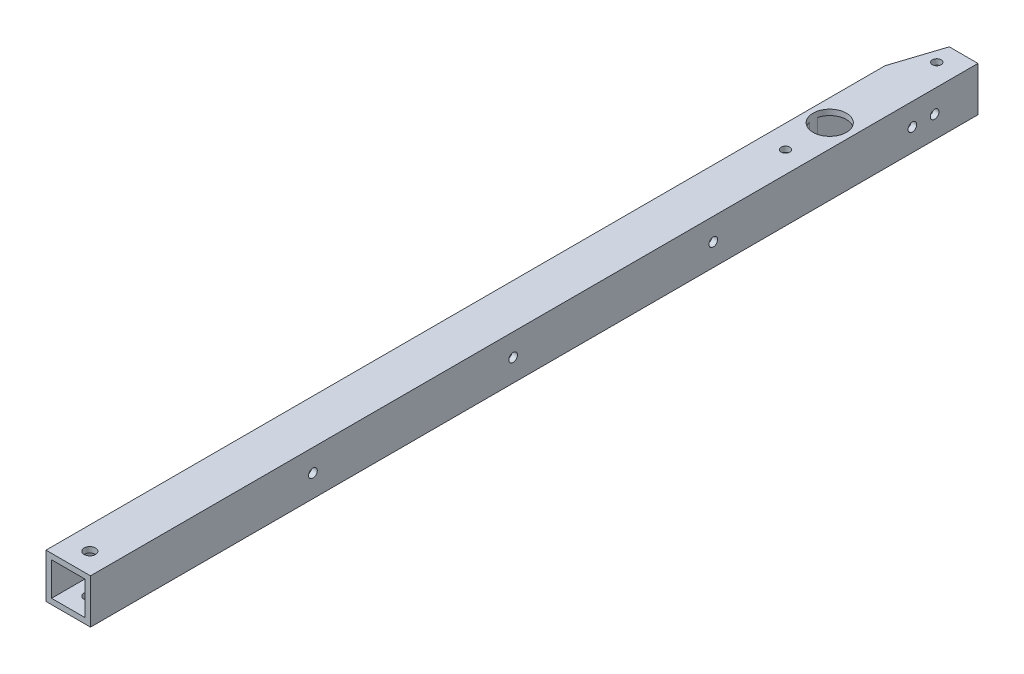
ISO-10303-21;
HEADER;
FILE_DESCRIPTION(('STEP AP214'),'2;1');
FILE_NAME('part.step','',(''),(''),'','','');
FILE_SCHEMA(('AUTOMOTIVE_DESIGN { 1 0 10303 214 1 1 1 1 }'));
ENDSEC;
DATA;
#1=APPLICATION_CONTEXT('core data for automotive mechanical design processes');
#2=APPLICATION_PROTOCOL_DEFINITION('international standard','automotive_design',2000,#1);
#3=PRODUCT_CONTEXT('',#1,'mechanical');
#4=PRODUCT('Part','Part','',(#3));
#5=PRODUCT_RELATED_PRODUCT_CATEGORY('part','',(#4));
#6=PRODUCT_DEFINITION_FORMATION('','',#4);
#7=PRODUCT_DEFINITION_CONTEXT('part definition',#1,'design');
#8=PRODUCT_DEFINITION('design','',#6,#7);
#9=PRODUCT_DEFINITION_SHAPE('','',#8);
#10=(LENGTH_UNIT() NAMED_UNIT(*) SI_UNIT(.MILLI.,.METRE.));
#11=(NAMED_UNIT(*) PLANE_ANGLE_UNIT() SI_UNIT($,.RADIAN.));
#12=(NAMED_UNIT(*) SI_UNIT($,.STERADIAN.) SOLID_ANGLE_UNIT());
#13=UNCERTAINTY_MEASURE_WITH_UNIT(LENGTH_MEASURE(1.E-05),#10,'distance_accuracy_value','');
#14=(GEOMETRIC_REPRESENTATION_CONTEXT(3) GLOBAL_UNCERTAINTY_ASSIGNED_CONTEXT((#13)) GLOBAL_UNIT_ASSIGNED_CONTEXT((#10,
#11,#12)) REPRESENTATION_CONTEXT('',''));
#15=CARTESIAN_POINT('',(0.,0.,0.));
#16=DIRECTION('',(0.,0.,1.));
#17=DIRECTION('',(1.,0.,0.));
#18=AXIS2_PLACEMENT_3D('',#15,#16,#17);
#19=CARTESIAN_POINT('',(-9.52500000000001,9.525,260.35));
#20=DIRECTION('',(1.,0.,0.));
#21=DIRECTION('',(0.,1.,0.));
#22=AXIS2_PLACEMENT_3D('',#19,#20,#21);
#23=PLANE('',#22);
#24=DIRECTION('',(0.,0.,-1.));
#25=VECTOR('',#24,1.);
#26=CARTESIAN_POINT('',(-9.52500000000001,9.525,260.35));
#27=LINE('',#26,#25);
#28=CARTESIAN_POINT('',(-9.52500000000001,9.525,-176.988287951056));
#29=VERTEX_POINT('',#28);
#30=CARTESIAN_POINT('',(-9.52500000000001,9.525,-228.433852769317));
#31=VERTEX_POINT('',#30);
#32=EDGE_CURVE('E149',#29,#31,#27,.T.);
#33=ORIENTED_EDGE('',*,*,#32,.F.);
#34=DIRECTION('',(0.,1.,0.));
#35=VECTOR('',#34,1.);
#36=CARTESIAN_POINT('',(-9.525,-12.7,-176.988287951056));
#37=LINE('',#36,#35);
#38=CARTESIAN_POINT('',(-9.525,-9.525,-176.988287951056));
#39=VERTEX_POINT('',#38);
#40=EDGE_CURVE('E56',#29,#39,#37,.F.);
#41=ORIENTED_EDGE('',*,*,#40,.T.);
#42=DIRECTION('',(0.,0.,-1.));
#43=VECTOR('',#42,1.);
#44=CARTESIAN_POINT('',(-9.525,-9.525,260.35));
#45=LINE('',#44,#43);
#46=CARTESIAN_POINT('',(-9.525,-9.525,-228.433852769318));
#47=VERTEX_POINT('',#46);
#48=EDGE_CURVE('E159',#39,#47,#45,.T.);
#49=ORIENTED_EDGE('',*,*,#48,.T.);
#50=DIRECTION('',(0.,-1.,0.));
#51=VECTOR('',#50,1.);
#52=CARTESIAN_POINT('',(-9.52500000000001,9.52500000000048,-228.433852769317));
#53=LINE('',#52,#51);
#54=EDGE_CURVE('E265',#31,#47,#53,.T.);
#55=ORIENTED_EDGE('',*,*,#54,.F.);
#56=EDGE_LOOP('',(#33,#41,#49,#55));
#57=FACE_BOUND('',#56,.T.);
#58=ADVANCED_FACE('F39',(#57),#23,.T.);
#59=CARTESIAN_POINT('',(-9.525,0.,101.6));
#60=DIRECTION('',(1.,0.,0.));
#61=DIRECTION('',(0.,1.,0.));
#62=AXIS2_PLACEMENT_3D('',#59,#60,#61);
#63=CIRCLE('',#62,3.17499999999999);
#64=CARTESIAN_POINT('',(-9.525,3.17499999999997,101.6));
#65=VERTEX_POINT('',#64);
#66=EDGE_CURVE('E390',#65,#65,#63,.T.);
#67=ORIENTED_EDGE('',*,*,#66,.F.);
#68=EDGE_LOOP('',(#67));
#69=FACE_BOUND('',#68,.T.);
#70=CARTESIAN_POINT('',(-9.525,0.,228.6));
#71=DIRECTION('',(1.,0.,0.));
#72=DIRECTION('',(0.,1.,0.));
#73=AXIS2_PLACEMENT_3D('',#70,#71,#72);
#74=CIRCLE('',#73,3.17499999999999);
#75=CARTESIAN_POINT('',(-9.525,3.17499999999998,228.6));
#76=VERTEX_POINT('',#75);
#77=EDGE_CURVE('E400',#76,#76,#74,.T.);
#78=ORIENTED_EDGE('',*,*,#77,.F.);
#79=EDGE_LOOP('',(#78));
#80=FACE_BOUND('',#79,.T.);
#81=CARTESIAN_POINT('',(-9.525,0.,133.35));
#82=DIRECTION('',(1.,0.,0.));
#83=DIRECTION('',(0.,1.,0.));
#84=AXIS2_PLACEMENT_3D('',#81,#82,#83);
#85=CIRCLE('',#84,2.48919999999999);
#86=CARTESIAN_POINT('',(-9.525,2.48919999999999,133.35));
#87=VERTEX_POINT('',#86);
#88=EDGE_CURVE('E412',#87,#87,#85,.T.);
#89=ORIENTED_EDGE('',*,*,#88,.F.);
#90=EDGE_LOOP('',(#89));
#91=FACE_BOUND('',#90,.T.);
#92=CARTESIAN_POINT('',(-9.525,0.,19.05));
#93=DIRECTION('',(1.,0.,0.));
#94=DIRECTION('',(0.,1.,0.));
#95=AXIS2_PLACEMENT_3D('',#92,#93,#94);
#96=CIRCLE('',#95,2.48919999999999);
#97=CARTESIAN_POINT('',(-9.525,2.48919999999999,19.05));
#98=VERTEX_POINT('',#97);
#99=EDGE_CURVE('E424',#98,#98,#96,.T.);
#100=ORIENTED_EDGE('',*,*,#99,.F.);
#101=EDGE_LOOP('',(#100));
#102=FACE_BOUND('',#101,.T.);
#103=CARTESIAN_POINT('',(-9.525,0.,-95.25));
#104=DIRECTION('',(1.,0.,0.));
#105=DIRECTION('',(0.,1.,0.));
#106=AXIS2_PLACEMENT_3D('',#103,#104,#105);
#107=CIRCLE('',#106,2.48919999999999);
#108=CARTESIAN_POINT('',(-9.525,2.48919999999999,-95.25));
#109=VERTEX_POINT('',#108);
#110=EDGE_CURVE('E435',#109,#109,#107,.T.);
#111=ORIENTED_EDGE('',*,*,#110,.F.);
#112=EDGE_LOOP('',(#111));
#113=FACE_BOUND('',#112,.T.);
#114=CARTESIAN_POINT('',(-9.525,-9.525,260.35));
#115=VERTEX_POINT('',#114);
#116=CARTESIAN_POINT('',(-9.525,-9.525,-172.41416606707));
#117=VERTEX_POINT('',#116);
#118=EDGE_CURVE('E142',#115,#117,#45,.T.);
#119=ORIENTED_EDGE('',*,*,#118,.T.);
#120=DIRECTION('',(0.,1.,0.));
#121=VECTOR('',#120,1.);
#122=CARTESIAN_POINT('',(-9.525,-12.7,-172.41416606707));
#123=LINE('',#122,#121);
#124=CARTESIAN_POINT('',(-9.52500000000001,9.525,-172.41416606707));
#125=VERTEX_POINT('',#124);
#126=EDGE_CURVE('E130',#117,#125,#123,.T.);
#127=ORIENTED_EDGE('',*,*,#126,.T.);
#128=CARTESIAN_POINT('',(-9.52500000000001,9.525,260.35));
#129=VERTEX_POINT('',#128);
#130=EDGE_CURVE('E139',#129,#125,#27,.T.);
#131=ORIENTED_EDGE('',*,*,#130,.F.);
#132=DIRECTION('',(0.,-1.,0.));
#133=VECTOR('',#132,1.);
#134=CARTESIAN_POINT('',(-9.52500000000001,9.525,260.35));
#135=LINE('',#134,#133);
#136=EDGE_CURVE('E270',#129,#115,#135,.T.);
#137=ORIENTED_EDGE('',*,*,#136,.T.);
#138=EDGE_LOOP('',(#119,#127,#131,#137));
#139=FACE_BOUND('',#138,.T.);
#140=ADVANCED_FACE('F138',(#69,#80,#91,#102,#113,#139),#23,.T.);
#141=CARTESIAN_POINT('',(0.,0.,260.35));
#142=DIRECTION('',(0.,0.,1.));
#143=DIRECTION('',(1.,0.,0.));
#144=AXIS2_PLACEMENT_3D('',#141,#142,#143);
#145=PLANE('',#144);
#146=DIRECTION('',(0.,-1.,0.));
#147=VECTOR('',#146,1.);
#148=CARTESIAN_POINT('',(-12.7,12.7,260.35));
#149=LINE('',#148,#147);
#150=CARTESIAN_POINT('',(-12.7,12.7,260.35));
#151=VERTEX_POINT('',#150);
#152=CARTESIAN_POINT('',(-12.7,-12.7,260.35));
#153=VERTEX_POINT('',#152);
#154=EDGE_CURVE('E161',#151,#153,#149,.T.);
#155=ORIENTED_EDGE('',*,*,#154,.T.);
#156=DIRECTION('',(1.,0.,0.));
#157=VECTOR('',#156,1.);
#158=CARTESIAN_POINT('',(-12.7,-12.7,260.35));
#159=LINE('',#158,#157);
#160=CARTESIAN_POINT('',(12.7,-12.7,260.35));
#161=VERTEX_POINT('',#160);
#162=EDGE_CURVE('E164',#153,#161,#159,.T.);
#163=ORIENTED_EDGE('',*,*,#162,.T.);
#164=DIRECTION('',(0.,1.,0.));
#165=VECTOR('',#164,1.);
#166=CARTESIAN_POINT('',(12.7,-12.7,260.35));
#167=LINE('',#166,#165);
#168=CARTESIAN_POINT('',(12.7,12.7,260.35));
#169=VERTEX_POINT('',#168);
#170=EDGE_CURVE('E166',#161,#169,#167,.T.);
#171=ORIENTED_EDGE('',*,*,#170,.T.);
#172=DIRECTION('',(-1.,0.,0.));
#173=VECTOR('',#172,1.);
#174=CARTESIAN_POINT('',(12.7,12.7,260.35));
#175=LINE('',#174,#173);
#176=EDGE_CURVE('E168',#169,#151,#175,.T.);
#177=ORIENTED_EDGE('',*,*,#176,.T.);
#178=EDGE_LOOP('',(#155,#163,#171,#177));
#179=FACE_BOUND('',#178,.T.);
#180=DIRECTION('',(1.,0.,0.));
#181=VECTOR('',#180,1.);
#182=CARTESIAN_POINT('',(-9.525,-9.525,260.35));
#183=LINE('',#182,#181);
#184=CARTESIAN_POINT('',(9.52500000000001,-9.525,260.35));
#185=VERTEX_POINT('',#184);
#186=EDGE_CURVE('E272',#115,#185,#183,.T.);
#187=ORIENTED_EDGE('',*,*,#186,.F.);
#188=ORIENTED_EDGE('',*,*,#136,.F.);
#189=DIRECTION('',(-1.,0.,0.));
#190=VECTOR('',#189,1.);
#191=CARTESIAN_POINT('',(9.525,9.525,260.35));
#192=LINE('',#191,#190);
#193=CARTESIAN_POINT('',(9.525,9.525,260.35));
#194=VERTEX_POINT('',#193);
#195=EDGE_CURVE('E147',#194,#129,#192,.T.);
#196=ORIENTED_EDGE('',*,*,#195,.F.);
#197=DIRECTION('',(0.,1.,0.));
#198=VECTOR('',#197,1.);
#199=CARTESIAN_POINT('',(9.52500000000001,-9.525,260.35));
#200=LINE('',#199,#198);
#201=EDGE_CURVE('E273',#185,#194,#200,.T.);
#202=ORIENTED_EDGE('',*,*,#201,.F.);
#203=EDGE_LOOP('',(#187,#188,#196,#202));
#204=FACE_BOUND('',#203,.T.);
#205=ADVANCED_FACE('F282',(#179,#204),#145,.T.);
#206=CARTESIAN_POINT('',(-12.7,12.7,260.35));
#207=DIRECTION('',(1.,0.,0.));
#208=DIRECTION('',(0.,0.,-1.));
#209=AXIS2_PLACEMENT_3D('',#206,#207,#208);
#210=PLANE('',#209);
#211=CARTESIAN_POINT('',(-12.7,0.,101.6));
#212=DIRECTION('',(-1.,0.,0.));
#213=DIRECTION('',(0.,0.,1.));
#214=AXIS2_PLACEMENT_3D('',#211,#212,#213);
#215=CIRCLE('',#214,3.17499999999999);
#216=CARTESIAN_POINT('',(-12.7,0.,104.775));
#217=VERTEX_POINT('',#216);
#218=EDGE_CURVE('E393',#217,#217,#215,.T.);
#219=ORIENTED_EDGE('',*,*,#218,.F.);
#220=EDGE_LOOP('',(#219));
#221=FACE_BOUND('',#220,.T.);
#222=CARTESIAN_POINT('',(-12.7,0.,228.6));
#223=DIRECTION('',(-1.,0.,0.));
#224=DIRECTION('',(0.,0.,1.));
#225=AXIS2_PLACEMENT_3D('',#222,#223,#224);
#226=CIRCLE('',#225,3.17499999999999);
#227=CARTESIAN_POINT('',(-12.7,0.,231.775));
#228=VERTEX_POINT('',#227);
#229=EDGE_CURVE('E395',#228,#228,#226,.T.);
#230=ORIENTED_EDGE('',*,*,#229,.F.);
#231=EDGE_LOOP('',(#230));
#232=FACE_BOUND('',#231,.T.);
#233=CARTESIAN_POINT('',(-12.7,0.,133.35));
#234=DIRECTION('',(1.,0.,0.));
#235=DIRECTION('',(0.,0.,-1.));
#236=AXIS2_PLACEMENT_3D('',#233,#234,#235);
#237=CIRCLE('',#236,2.48919999999999);
#238=CARTESIAN_POINT('',(-12.7,0.,130.8608));
#239=VERTEX_POINT('',#238);
#240=EDGE_CURVE('E406',#239,#239,#237,.T.);
#241=ORIENTED_EDGE('',*,*,#240,.T.);
#242=EDGE_LOOP('',(#241));
#243=FACE_BOUND('',#242,.T.);
#244=CARTESIAN_POINT('',(-12.7,0.,19.05));
#245=DIRECTION('',(1.,0.,0.));
#246=DIRECTION('',(0.,0.,-1.));
#247=AXIS2_PLACEMENT_3D('',#244,#245,#246);
#248=CIRCLE('',#247,2.48919999999999);
#249=CARTESIAN_POINT('',(-12.7,0.,16.5608));
#250=VERTEX_POINT('',#249);
#251=EDGE_CURVE('E418',#250,#250,#248,.T.);
#252=ORIENTED_EDGE('',*,*,#251,.T.);
#253=EDGE_LOOP('',(#252));
#254=FACE_BOUND('',#253,.T.);
#255=CARTESIAN_POINT('',(-12.7,0.,-95.25));
#256=DIRECTION('',(1.,0.,0.));
#257=DIRECTION('',(0.,0.,-1.));
#258=AXIS2_PLACEMENT_3D('',#255,#256,#257);
#259=CIRCLE('',#258,2.48919999999999);
#260=CARTESIAN_POINT('',(-12.7,0.,-97.7392));
#261=VERTEX_POINT('',#260);
#262=EDGE_CURVE('E430',#261,#261,#259,.T.);
#263=ORIENTED_EDGE('',*,*,#262,.T.);
#264=EDGE_LOOP('',(#263));
#265=FACE_BOUND('',#264,.T.);
#266=DIRECTION('',(0.,0.,-1.));
#267=VECTOR('',#266,1.);
#268=CARTESIAN_POINT('',(-12.7,12.7,260.35));
#269=LINE('',#268,#267);
#270=CARTESIAN_POINT('',(-12.7,12.7,-218.66352));
#271=VERTEX_POINT('',#270);
#272=EDGE_CURVE('E170',#151,#271,#269,.T.);
#273=ORIENTED_EDGE('',*,*,#272,.T.);
#274=DIRECTION('',(0.,1.,0.));
#275=VECTOR('',#274,1.);
#276=CARTESIAN_POINT('',(-12.7,-12.7,-218.66352));
#277=LINE('',#276,#275);
#278=CARTESIAN_POINT('',(-12.7,-12.7,-218.66352));
#279=VERTEX_POINT('',#278);
#280=EDGE_CURVE('E253',#279,#271,#277,.T.);
#281=ORIENTED_EDGE('',*,*,#280,.F.);
#282=DIRECTION('',(0.,0.,-1.));
#283=VECTOR('',#282,1.);
#284=CARTESIAN_POINT('',(-12.7,-12.7,260.35));
#285=LINE('',#284,#283);
#286=EDGE_CURVE('E179',#153,#279,#285,.T.);
#287=ORIENTED_EDGE('',*,*,#286,.F.);
#288=ORIENTED_EDGE('',*,*,#154,.F.);
#289=EDGE_LOOP('',(#273,#281,#287,#288));
#290=FACE_BOUND('',#289,.T.);
#291=ADVANCED_FACE('F41',(#221,#232,#243,#254,#265,#290),#210,.F.);
#292=CARTESIAN_POINT('',(-12.7,-12.7,260.35));
#293=DIRECTION('',(0.,1.,0.));
#294=DIRECTION('',(-1.,0.,0.));
#295=AXIS2_PLACEMENT_3D('',#292,#293,#294);
#296=PLANE('',#295);
#297=CARTESIAN_POINT('',(0.363325870756843,-12.7,248.383604688493));
#298=DIRECTION('',(0.,-1.,0.));
#299=DIRECTION('',(0.,0.,-1.));
#300=AXIS2_PLACEMENT_3D('',#297,#298,#299);
#301=CIRCLE('',#300,3.26389999999999);
#302=CARTESIAN_POINT('',(0.363325870756843,-12.7,245.119704688493));
#303=VERTEX_POINT('',#302);
#304=EDGE_CURVE('E202',#303,#303,#301,.T.);
#305=ORIENTED_EDGE('',*,*,#304,.F.);
#306=EDGE_LOOP('',(#305));
#307=FACE_BOUND('',#306,.T.);
#308=CARTESIAN_POINT('',(0.379005455547326,-12.7,-148.784459398755));
#309=DIRECTION('',(0.,-1.,0.));
#310=DIRECTION('',(0.,0.,-1.));
#311=AXIS2_PLACEMENT_3D('',#308,#309,#310);
#312=CIRCLE('',#311,2.48919999999999);
#313=CARTESIAN_POINT('',(0.379005455547326,-12.7,-151.273659398755));
#314=VERTEX_POINT('',#313);
#315=EDGE_CURVE('E221',#314,#314,#312,.T.);
#316=ORIENTED_EDGE('',*,*,#315,.F.);
#317=EDGE_LOOP('',(#316));
#318=FACE_BOUND('',#317,.T.);
#319=CARTESIAN_POINT('',(0.382415862611759,-12.7,-235.170979471437));
#320=DIRECTION('',(0.,-1.,0.));
#321=DIRECTION('',(0.,0.,-1.));
#322=AXIS2_PLACEMENT_3D('',#319,#320,#321);
#323=CIRCLE('',#322,2.48919999999999);
#324=CARTESIAN_POINT('',(0.382415862611759,-12.7,-237.660179471436));
#325=VERTEX_POINT('',#324);
#326=EDGE_CURVE('E228',#325,#325,#323,.T.);
#327=ORIENTED_EDGE('',*,*,#326,.F.);
#328=EDGE_LOOP('',(#327));
#329=FACE_BOUND('',#328,.T.);
#330=CARTESIAN_POINT('',(-0.278650598879025,-12.7,-174.701227009063));
#331=DIRECTION('',(0.,-1.,0.));
#332=DIRECTION('',(1.,0.,0.));
#333=AXIS2_PLACEMENT_3D('',#330,#331,#332);
#334=CIRCLE('',#333,9.52499999999999);
#335=CARTESIAN_POINT('',(9.24634940112097,-12.7,-174.701227009063));
#336=VERTEX_POINT('',#335);
#337=EDGE_CURVE('E143',#336,#336,#334,.T.);
#338=ORIENTED_EDGE('',*,*,#337,.F.);
#339=EDGE_LOOP('',(#338));
#340=FACE_BOUND('',#339,.T.);
#341=ORIENTED_EDGE('',*,*,#286,.T.);
#342=DIRECTION('',(0.309054540384021,0.,-0.951044316037913));
#343=VECTOR('',#342,1.);
#344=CARTESIAN_POINT('',(-3.69316,-12.7,-246.38));
#345=LINE('',#344,#343);
#346=CARTESIAN_POINT('',(-3.69316,-12.7,-246.38));
#347=VERTEX_POINT('',#346);
#348=EDGE_CURVE('E243',#279,#347,#345,.T.);
#349=ORIENTED_EDGE('',*,*,#348,.T.);
#350=DIRECTION('',(1.,0.,0.));
#351=VECTOR('',#350,1.);
#352=CARTESIAN_POINT('',(12.7,-12.7,-246.38));
#353=LINE('',#352,#351);
#354=CARTESIAN_POINT('',(12.7,-12.7,-246.38));
#355=VERTEX_POINT('',#354);
#356=EDGE_CURVE('E246',#347,#355,#353,.T.);
#357=ORIENTED_EDGE('',*,*,#356,.T.);
#358=DIRECTION('',(0.,0.,-1.));
#359=VECTOR('',#358,1.);
#360=CARTESIAN_POINT('',(12.7,-12.7,260.35));
#361=LINE('',#360,#359);
#362=EDGE_CURVE('E176',#161,#355,#361,.T.);
#363=ORIENTED_EDGE('',*,*,#362,.F.);
#364=ORIENTED_EDGE('',*,*,#162,.F.);
#365=EDGE_LOOP('',(#341,#349,#357,#363,#364));
#366=FACE_BOUND('',#365,.T.);
#367=ADVANCED_FACE('F306',(#307,#318,#329,#340,#366),#296,.F.);
#368=CARTESIAN_POINT('',(12.7,-12.7,260.35));
#369=DIRECTION('',(-1.,0.,0.));
#370=DIRECTION('',(0.,0.,1.));
#371=AXIS2_PLACEMENT_3D('',#368,#369,#370);
#372=PLANE('',#371);
#373=CARTESIAN_POINT('',(12.7,0.,133.35));
#374=DIRECTION('',(1.,0.,0.));
#375=DIRECTION('',(0.,0.,-1.));
#376=AXIS2_PLACEMENT_3D('',#373,#374,#375);
#377=CIRCLE('',#376,2.48919999999999);
#378=CARTESIAN_POINT('',(12.7,0.,130.8608));
#379=VERTEX_POINT('',#378);
#380=EDGE_CURVE('E403',#379,#379,#377,.T.);
#381=ORIENTED_EDGE('',*,*,#380,.F.);
#382=EDGE_LOOP('',(#381));
#383=FACE_BOUND('',#382,.T.);
#384=CARTESIAN_POINT('',(12.7,0.,19.05));
#385=DIRECTION('',(1.,0.,0.));
#386=DIRECTION('',(0.,0.,-1.));
#387=AXIS2_PLACEMENT_3D('',#384,#385,#386);
#388=CIRCLE('',#387,2.48919999999999);
#389=CARTESIAN_POINT('',(12.7,0.,16.5608));
#390=VERTEX_POINT('',#389);
#391=EDGE_CURVE('E415',#390,#390,#388,.T.);
#392=ORIENTED_EDGE('',*,*,#391,.F.);
#393=EDGE_LOOP('',(#392));
#394=FACE_BOUND('',#393,.T.);
#395=CARTESIAN_POINT('',(12.7,0.,-95.25));
#396=DIRECTION('',(1.,0.,0.));
#397=DIRECTION('',(0.,0.,-1.));
#398=AXIS2_PLACEMENT_3D('',#395,#396,#397);
#399=CIRCLE('',#398,2.48919999999999);
#400=CARTESIAN_POINT('',(12.7,0.,-97.7392));
#401=VERTEX_POINT('',#400);
#402=EDGE_CURVE('E427',#401,#401,#399,.T.);
#403=ORIENTED_EDGE('',*,*,#402,.F.);
#404=EDGE_LOOP('',(#403));
#405=FACE_BOUND('',#404,.T.);
#406=CARTESIAN_POINT('',(12.7,-0.0595961363051845,-221.6129097405));
#407=DIRECTION('',(1.,0.,0.));
#408=DIRECTION('',(0.,0.,-1.));
#409=AXIS2_PLACEMENT_3D('',#406,#407,#408);
#410=CIRCLE('',#409,2.48919999999999);
#411=CARTESIAN_POINT('',(12.7,-0.0595961363051845,-224.1021097405));
#412=VERTEX_POINT('',#411);
#413=EDGE_CURVE('E213',#412,#412,#410,.T.);
#414=ORIENTED_EDGE('',*,*,#413,.F.);
#415=EDGE_LOOP('',(#414));
#416=FACE_BOUND('',#415,.T.);
#417=CARTESIAN_POINT('',(12.7,0.,-208.915));
#418=DIRECTION('',(1.,0.,0.));
#419=DIRECTION('',(0.,0.,-1.));
#420=AXIS2_PLACEMENT_3D('',#417,#418,#419);
#421=CIRCLE('',#420,2.48919999999999);
#422=CARTESIAN_POINT('',(12.7,0.,-211.4042));
#423=VERTEX_POINT('',#422);
#424=EDGE_CURVE('E203',#423,#423,#421,.T.);
#425=ORIENTED_EDGE('',*,*,#424,.F.);
#426=EDGE_LOOP('',(#425));
#427=FACE_BOUND('',#426,.T.);
#428=ORIENTED_EDGE('',*,*,#362,.T.);
#429=DIRECTION('',(0.,1.,0.));
#430=VECTOR('',#429,1.);
#431=CARTESIAN_POINT('',(12.7,-12.7,-246.38));
#432=LINE('',#431,#430);
#433=CARTESIAN_POINT('',(12.7,12.7,-246.38));
#434=VERTEX_POINT('',#433);
#435=EDGE_CURVE('E256',#355,#434,#432,.T.);
#436=ORIENTED_EDGE('',*,*,#435,.T.);
#437=DIRECTION('',(0.,0.,-1.));
#438=VECTOR('',#437,1.);
#439=CARTESIAN_POINT('',(12.7,12.7,260.35));
#440=LINE('',#439,#438);
#441=EDGE_CURVE('E173',#169,#434,#440,.T.);
#442=ORIENTED_EDGE('',*,*,#441,.F.);
#443=ORIENTED_EDGE('',*,*,#170,.F.);
#444=EDGE_LOOP('',(#428,#436,#442,#443));
#445=FACE_BOUND('',#444,.T.);
#446=ADVANCED_FACE('F302',(#383,#394,#405,#416,#427,#445),#372,.F.);
#447=CARTESIAN_POINT('',(12.7,12.7,260.35));
#448=DIRECTION('',(0.,-1.,0.));
#449=DIRECTION('',(1.,0.,0.));
#450=AXIS2_PLACEMENT_3D('',#447,#448,#449);
#451=PLANE('',#450);
#452=CARTESIAN_POINT('',(0.363325870756843,12.7,248.383604688493));
#453=DIRECTION('',(0.,-1.,0.));
#454=DIRECTION('',(0.,0.,-1.));
#455=AXIS2_PLACEMENT_3D('',#452,#453,#454);
#456=CIRCLE('',#455,3.26389999999999);
#457=CARTESIAN_POINT('',(0.363325870756843,12.7,245.119704688493));
#458=VERTEX_POINT('',#457);
#459=EDGE_CURVE('E199',#458,#458,#456,.T.);
#460=ORIENTED_EDGE('',*,*,#459,.T.);
#461=EDGE_LOOP('',(#460));
#462=FACE_BOUND('',#461,.T.);
#463=CARTESIAN_POINT('',(0.379005455547326,12.7,-148.784459398755));
#464=DIRECTION('',(0.,-1.,0.));
#465=DIRECTION('',(0.,0.,-1.));
#466=AXIS2_PLACEMENT_3D('',#463,#464,#465);
#467=CIRCLE('',#466,2.4892);
#468=CARTESIAN_POINT('',(0.379005455547326,12.7,-151.273659398755));
#469=VERTEX_POINT('',#468);
#470=EDGE_CURVE('E195',#469,#469,#467,.T.);
#471=ORIENTED_EDGE('',*,*,#470,.T.);
#472=EDGE_LOOP('',(#471));
#473=FACE_BOUND('',#472,.T.);
#474=CARTESIAN_POINT('',(0.382415862611759,12.7,-235.170979471437));
#475=DIRECTION('',(0.,-1.,0.));
#476=DIRECTION('',(0.,0.,-1.));
#477=AXIS2_PLACEMENT_3D('',#474,#475,#476);
#478=CIRCLE('',#477,2.4892);
#479=CARTESIAN_POINT('',(0.382415862611759,12.7,-237.660179471436));
#480=VERTEX_POINT('',#479);
#481=EDGE_CURVE('E190',#480,#480,#478,.T.);
#482=ORIENTED_EDGE('',*,*,#481,.T.);
#483=EDGE_LOOP('',(#482));
#484=FACE_BOUND('',#483,.T.);
#485=CARTESIAN_POINT('',(-0.278650598879021,12.7,-174.701227009063));
#486=DIRECTION('',(0.,-1.,0.));
#487=DIRECTION('',(1.,0.,0.));
#488=AXIS2_PLACEMENT_3D('',#485,#486,#487);
#489=CIRCLE('',#488,9.52499999999999);
#490=CARTESIAN_POINT('',(9.24634940112097,12.7,-174.701227009063));
#491=VERTEX_POINT('',#490);
#492=EDGE_CURVE('E235',#491,#491,#489,.T.);
#493=ORIENTED_EDGE('',*,*,#492,.T.);
#494=EDGE_LOOP('',(#493));
#495=FACE_BOUND('',#494,.T.);
#496=DIRECTION('',(1.,0.,0.));
#497=VECTOR('',#496,1.);
#498=CARTESIAN_POINT('',(12.7,12.7,-246.38));
#499=LINE('',#498,#497);
#500=CARTESIAN_POINT('',(-3.69316,12.7,-246.38));
#501=VERTEX_POINT('',#500);
#502=EDGE_CURVE('E247',#501,#434,#499,.T.);
#503=ORIENTED_EDGE('',*,*,#502,.F.);
#504=DIRECTION('',(0.309054540384021,0.,-0.951044316037913));
#505=VECTOR('',#504,1.);
#506=CARTESIAN_POINT('',(-3.69316,12.7,-246.38));
#507=LINE('',#506,#505);
#508=EDGE_CURVE('E63',#271,#501,#507,.T.);
#509=ORIENTED_EDGE('',*,*,#508,.F.);
#510=ORIENTED_EDGE('',*,*,#272,.F.);
#511=ORIENTED_EDGE('',*,*,#176,.F.);
#512=ORIENTED_EDGE('',*,*,#441,.T.);
#513=EDGE_LOOP('',(#503,#509,#510,#511,#512));
#514=FACE_BOUND('',#513,.T.);
#515=ADVANCED_FACE('F296',(#462,#473,#484,#495,#514),#451,.F.);
#516=CARTESIAN_POINT('',(-9.525,-9.525,260.35));
#517=DIRECTION('',(0.,1.,0.));
#518=DIRECTION('',(0.,0.,1.));
#519=AXIS2_PLACEMENT_3D('',#516,#517,#518);
#520=PLANE('',#519);
#521=CARTESIAN_POINT('',(0.363325870756843,-9.525,248.383604688493));
#522=DIRECTION('',(0.,1.,0.));
#523=DIRECTION('',(0.,0.,1.));
#524=AXIS2_PLACEMENT_3D('',#521,#522,#523);
#525=CIRCLE('',#524,3.26389999999999);
#526=CARTESIAN_POINT('',(0.363325870756843,-9.525,251.647504688493));
#527=VERTEX_POINT('',#526);
#528=EDGE_CURVE('E196',#527,#527,#525,.T.);
#529=ORIENTED_EDGE('',*,*,#528,.F.);
#530=EDGE_LOOP('',(#529));
#531=FACE_BOUND('',#530,.T.);
#532=CARTESIAN_POINT('',(0.379005455547326,-9.525,-148.784459398755));
#533=DIRECTION('',(0.,1.,0.));
#534=DIRECTION('',(0.,0.,1.));
#535=AXIS2_PLACEMENT_3D('',#532,#533,#534);
#536=CIRCLE('',#535,2.48919999999999);
#537=CARTESIAN_POINT('',(0.379005455547326,-9.525,-146.295259398755));
#538=VERTEX_POINT('',#537);
#539=EDGE_CURVE('E194',#538,#538,#536,.T.);
#540=ORIENTED_EDGE('',*,*,#539,.F.);
#541=EDGE_LOOP('',(#540));
#542=FACE_BOUND('',#541,.T.);
#543=CARTESIAN_POINT('',(0.382415862611759,-9.525,-235.170979471437));
#544=DIRECTION('',(0.,1.,0.));
#545=DIRECTION('',(0.,0.,1.));
#546=AXIS2_PLACEMENT_3D('',#543,#544,#545);
#547=CIRCLE('',#546,2.48919999999999);
#548=CARTESIAN_POINT('',(0.382415862611759,-9.525,-232.681779471436));
#549=VERTEX_POINT('',#548);
#550=EDGE_CURVE('E189',#549,#549,#547,.T.);
#551=ORIENTED_EDGE('',*,*,#550,.F.);
#552=EDGE_LOOP('',(#551));
#553=FACE_BOUND('',#552,.T.);
#554=ORIENTED_EDGE('',*,*,#48,.F.);
#555=CARTESIAN_POINT('',(-0.278650598879024,-9.525,-174.701227009063));
#556=DIRECTION('',(0.,1.,0.));
#557=DIRECTION('',(0.,0.,1.));
#558=AXIS2_PLACEMENT_3D('',#555,#556,#557);
#559=CIRCLE('',#558,9.52499999999999);
#560=EDGE_CURVE('E241',#39,#117,#559,.F.);
#561=ORIENTED_EDGE('',*,*,#560,.T.);
#562=ORIENTED_EDGE('',*,*,#118,.F.);
#563=ORIENTED_EDGE('',*,*,#186,.T.);
#564=DIRECTION('',(0.,0.,-1.));
#565=VECTOR('',#564,1.);
#566=CARTESIAN_POINT('',(9.52500000000001,-9.525,260.35));
#567=LINE('',#566,#565);
#568=CARTESIAN_POINT('',(9.52500000000001,-9.525,-246.38));
#569=VERTEX_POINT('',#568);
#570=EDGE_CURVE('E152',#185,#569,#567,.T.);
#571=ORIENTED_EDGE('',*,*,#570,.T.);
#572=DIRECTION('',(1.,0.,0.));
#573=VECTOR('',#572,1.);
#574=CARTESIAN_POINT('',(-9.525,-9.525,-246.38));
#575=LINE('',#574,#573);
#576=CARTESIAN_POINT('',(-3.69316,-9.525,-246.38));
#577=VERTEX_POINT('',#576);
#578=EDGE_CURVE('E263',#577,#569,#575,.T.);
#579=ORIENTED_EDGE('',*,*,#578,.F.);
#580=DIRECTION('',(0.309054540384021,0.,-0.951044316037913));
#581=VECTOR('',#580,1.);
#582=CARTESIAN_POINT('',(-153.190580804676,-9.525,213.663952572088));
#583=LINE('',#582,#581);
#584=EDGE_CURVE('E268',#47,#577,#583,.T.);
#585=ORIENTED_EDGE('',*,*,#584,.F.);
#586=EDGE_LOOP('',(#554,#561,#562,#563,#571,#579,#585));
#587=FACE_BOUND('',#586,.T.);
#588=ADVANCED_FACE('F285',(#531,#542,#553,#587),#520,.T.);
#589=CARTESIAN_POINT('',(9.52500000000001,-9.525,260.35));
#590=DIRECTION('',(-1.,0.,0.));
#591=DIRECTION('',(0.,-1.,0.));
#592=AXIS2_PLACEMENT_3D('',#589,#590,#591);
#593=PLANE('',#592);
#594=CARTESIAN_POINT('',(9.525,0.,133.35));
#595=DIRECTION('',(-1.,0.,0.));
#596=DIRECTION('',(0.,-1.,0.));
#597=AXIS2_PLACEMENT_3D('',#594,#595,#596);
#598=CIRCLE('',#597,2.48919999999999);
#599=CARTESIAN_POINT('',(9.525,-2.48919999999999,133.35));
#600=VERTEX_POINT('',#599);
#601=EDGE_CURVE('E409',#600,#600,#598,.T.);
#602=ORIENTED_EDGE('',*,*,#601,.F.);
#603=EDGE_LOOP('',(#602));
#604=FACE_BOUND('',#603,.T.);
#605=CARTESIAN_POINT('',(9.525,0.,19.05));
#606=DIRECTION('',(-1.,0.,0.));
#607=DIRECTION('',(0.,-1.,0.));
#608=AXIS2_PLACEMENT_3D('',#605,#606,#607);
#609=CIRCLE('',#608,2.48919999999999);
#610=CARTESIAN_POINT('',(9.525,-2.48919999999999,19.05));
#611=VERTEX_POINT('',#610);
#612=EDGE_CURVE('E421',#611,#611,#609,.T.);
#613=ORIENTED_EDGE('',*,*,#612,.F.);
#614=EDGE_LOOP('',(#613));
#615=FACE_BOUND('',#614,.T.);
#616=CARTESIAN_POINT('',(9.525,0.,-95.25));
#617=DIRECTION('',(-1.,0.,0.));
#618=DIRECTION('',(0.,-1.,0.));
#619=AXIS2_PLACEMENT_3D('',#616,#617,#618);
#620=CIRCLE('',#619,2.48919999999999);
#621=CARTESIAN_POINT('',(9.525,-2.48919999999999,-95.25));
#622=VERTEX_POINT('',#621);
#623=EDGE_CURVE('E433',#622,#622,#620,.T.);
#624=ORIENTED_EDGE('',*,*,#623,.F.);
#625=EDGE_LOOP('',(#624));
#626=FACE_BOUND('',#625,.T.);
#627=CARTESIAN_POINT('',(9.525,-0.0595961363051845,-221.6129097405));
#628=DIRECTION('',(-1.,0.,0.));
#629=DIRECTION('',(0.,-1.,0.));
#630=AXIS2_PLACEMENT_3D('',#627,#628,#629);
#631=CIRCLE('',#630,2.48919999999999);
#632=CARTESIAN_POINT('',(9.525,-2.54879613630517,-221.6129097405));
#633=VERTEX_POINT('',#632);
#634=EDGE_CURVE('E43',#633,#633,#631,.T.);
#635=ORIENTED_EDGE('',*,*,#634,.F.);
#636=EDGE_LOOP('',(#635));
#637=FACE_BOUND('',#636,.T.);
#638=CARTESIAN_POINT('',(9.525,0.,-208.915));
#639=DIRECTION('',(-1.,0.,0.));
#640=DIRECTION('',(0.,-1.,0.));
#641=AXIS2_PLACEMENT_3D('',#638,#639,#640);
#642=CIRCLE('',#641,2.48919999999999);
#643=CARTESIAN_POINT('',(9.525,-2.4892,-208.915));
#644=VERTEX_POINT('',#643);
#645=EDGE_CURVE('E200',#644,#644,#642,.T.);
#646=ORIENTED_EDGE('',*,*,#645,.F.);
#647=EDGE_LOOP('',(#646));
#648=FACE_BOUND('',#647,.T.);
#649=DIRECTION('',(0.,1.,0.));
#650=VECTOR('',#649,1.);
#651=CARTESIAN_POINT('',(9.52500000000001,-9.525,-246.38));
#652=LINE('',#651,#650);
#653=CARTESIAN_POINT('',(9.525,9.525,-246.38));
#654=VERTEX_POINT('',#653);
#655=EDGE_CURVE('E255',#569,#654,#652,.T.);
#656=ORIENTED_EDGE('',*,*,#655,.F.);
#657=ORIENTED_EDGE('',*,*,#570,.F.);
#658=ORIENTED_EDGE('',*,*,#201,.T.);
#659=DIRECTION('',(0.,0.,-1.));
#660=VECTOR('',#659,1.);
#661=CARTESIAN_POINT('',(9.525,9.525,260.35));
#662=LINE('',#661,#660);
#663=EDGE_CURVE('E148',#194,#654,#662,.T.);
#664=ORIENTED_EDGE('',*,*,#663,.T.);
#665=EDGE_LOOP('',(#656,#657,#658,#664));
#666=FACE_BOUND('',#665,.T.);
#667=ADVANCED_FACE('F279',(#604,#615,#626,#637,#648,#666),#593,.T.);
#668=CARTESIAN_POINT('',(9.525,9.525,260.35));
#669=DIRECTION('',(0.,-1.,0.));
#670=DIRECTION('',(0.,0.,-1.));
#671=AXIS2_PLACEMENT_3D('',#668,#669,#670);
#672=PLANE('',#671);
#673=CARTESIAN_POINT('',(0.363325870756843,9.525,248.383604688493));
#674=DIRECTION('',(0.,-1.,0.));
#675=DIRECTION('',(0.,0.,-1.));
#676=AXIS2_PLACEMENT_3D('',#673,#674,#675);
#677=CIRCLE('',#676,3.26389999999999);
#678=CARTESIAN_POINT('',(0.363325870756843,9.525,245.119704688493));
#679=VERTEX_POINT('',#678);
#680=EDGE_CURVE('E198',#679,#679,#677,.T.);
#681=ORIENTED_EDGE('',*,*,#680,.F.);
#682=EDGE_LOOP('',(#681));
#683=FACE_BOUND('',#682,.T.);
#684=CARTESIAN_POINT('',(0.379005455547326,9.525,-148.784459398755));
#685=DIRECTION('',(0.,-1.,0.));
#686=DIRECTION('',(0.,0.,-1.));
#687=AXIS2_PLACEMENT_3D('',#684,#685,#686);
#688=CIRCLE('',#687,2.48919999999999);
#689=CARTESIAN_POINT('',(0.379005455547326,9.525,-151.273659398755));
#690=VERTEX_POINT('',#689);
#691=EDGE_CURVE('E191',#690,#690,#688,.T.);
#692=ORIENTED_EDGE('',*,*,#691,.F.);
#693=EDGE_LOOP('',(#692));
#694=FACE_BOUND('',#693,.T.);
#695=CARTESIAN_POINT('',(0.382415862611759,9.525,-235.170979471437));
#696=DIRECTION('',(0.,-1.,0.));
#697=DIRECTION('',(0.,0.,-1.));
#698=AXIS2_PLACEMENT_3D('',#695,#696,#697);
#699=CIRCLE('',#698,2.48919999999999);
#700=CARTESIAN_POINT('',(0.382415862611759,9.525,-237.660179471436));
#701=VERTEX_POINT('',#700);
#702=EDGE_CURVE('E186',#701,#701,#699,.T.);
#703=ORIENTED_EDGE('',*,*,#702,.F.);
#704=EDGE_LOOP('',(#703));
#705=FACE_BOUND('',#704,.T.);
#706=ORIENTED_EDGE('',*,*,#130,.T.);
#707=CARTESIAN_POINT('',(-0.278650598879022,9.525,-174.701227009063));
#708=DIRECTION('',(0.,-1.,0.));
#709=DIRECTION('',(0.,0.,-1.));
#710=AXIS2_PLACEMENT_3D('',#707,#708,#709);
#711=CIRCLE('',#710,9.52499999999999);
#712=EDGE_CURVE('E11',#125,#29,#711,.F.);
#713=ORIENTED_EDGE('',*,*,#712,.T.);
#714=ORIENTED_EDGE('',*,*,#32,.T.);
#715=DIRECTION('',(-0.309054540384021,0.,0.951044316037913));
#716=VECTOR('',#715,1.);
#717=CARTESIAN_POINT('',(-151.371025599522,9.525,208.064689628308));
#718=LINE('',#717,#716);
#719=CARTESIAN_POINT('',(-3.69316,9.525,-246.38));
#720=VERTEX_POINT('',#719);
#721=EDGE_CURVE('E48',#720,#31,#718,.T.);
#722=ORIENTED_EDGE('',*,*,#721,.F.);
#723=DIRECTION('',(-1.,0.,0.));
#724=VECTOR('',#723,1.);
#725=CARTESIAN_POINT('',(9.525,9.525,-246.38));
#726=LINE('',#725,#724);
#727=EDGE_CURVE('E182',#654,#720,#726,.T.);
#728=ORIENTED_EDGE('',*,*,#727,.F.);
#729=ORIENTED_EDGE('',*,*,#663,.F.);
#730=ORIENTED_EDGE('',*,*,#195,.T.);
#731=EDGE_LOOP('',(#706,#713,#714,#722,#728,#729,#730));
#732=FACE_BOUND('',#731,.T.);
#733=ADVANCED_FACE('F145',(#683,#694,#705,#732),#672,.T.);
#734=CARTESIAN_POINT('',(-3.69316,-12.7,-246.38));
#735=DIRECTION('',(0.951044316037913,0.,0.309054540384021));
#736=DIRECTION('',(0.309054540384021,0.,-0.951044316037913));
#737=AXIS2_PLACEMENT_3D('',#734,#735,#736);
#738=PLANE('',#737);
#739=ORIENTED_EDGE('',*,*,#584,.T.);
#740=DIRECTION('',(0.,1.,0.));
#741=VECTOR('',#740,1.);
#742=CARTESIAN_POINT('',(-3.69316,-12.7,-246.38));
#743=LINE('',#742,#741);
#744=EDGE_CURVE('E259',#347,#577,#743,.T.);
#745=ORIENTED_EDGE('',*,*,#744,.F.);
#746=ORIENTED_EDGE('',*,*,#348,.F.);
#747=ORIENTED_EDGE('',*,*,#280,.T.);
#748=ORIENTED_EDGE('',*,*,#508,.T.);
#749=EDGE_CURVE('E250',#720,#501,#743,.T.);
#750=ORIENTED_EDGE('',*,*,#749,.F.);
#751=ORIENTED_EDGE('',*,*,#721,.T.);
#752=ORIENTED_EDGE('',*,*,#54,.T.);
#753=EDGE_LOOP('',(#739,#745,#746,#747,#748,#750,#751,#752));
#754=FACE_BOUND('',#753,.T.);
#755=ADVANCED_FACE('F291',(#754),#738,.F.);
#756=CARTESIAN_POINT('',(12.7,-12.7,-246.38));
#757=DIRECTION('',(0.,0.,1.));
#758=DIRECTION('',(1.,0.,0.));
#759=AXIS2_PLACEMENT_3D('',#756,#757,#758);
#760=PLANE('',#759);
#761=ORIENTED_EDGE('',*,*,#578,.T.);
#762=ORIENTED_EDGE('',*,*,#655,.T.);
#763=ORIENTED_EDGE('',*,*,#727,.T.);
#764=ORIENTED_EDGE('',*,*,#749,.T.);
#765=ORIENTED_EDGE('',*,*,#502,.T.);
#766=ORIENTED_EDGE('',*,*,#435,.F.);
#767=ORIENTED_EDGE('',*,*,#356,.F.);
#768=ORIENTED_EDGE('',*,*,#744,.T.);
#769=EDGE_LOOP('',(#761,#762,#763,#764,#765,#766,#767,#768));
#770=FACE_BOUND('',#769,.T.);
#771=ADVANCED_FACE('F294',(#770),#760,.F.);
#772=CARTESIAN_POINT('',(-0.278650598879025,-12.7,-174.701227009063));
#773=DIRECTION('',(0.,1.,0.));
#774=DIRECTION('',(-1.,0.,0.));
#775=AXIS2_PLACEMENT_3D('',#772,#773,#774);
#776=CYLINDRICAL_SURFACE('',#775,9.52499999999999);
#777=ORIENTED_EDGE('',*,*,#40,.F.);
#778=ORIENTED_EDGE('',*,*,#712,.F.);
#779=ORIENTED_EDGE('',*,*,#126,.F.);
#780=ORIENTED_EDGE('',*,*,#560,.F.);
#781=EDGE_LOOP('',(#777,#778,#779,#780));
#782=FACE_BOUND('',#781,.T.);
#783=ORIENTED_EDGE('',*,*,#337,.T.);
#784=EDGE_LOOP('',(#783));
#785=FACE_BOUND('',#784,.T.);
#786=ORIENTED_EDGE('',*,*,#492,.F.);
#787=EDGE_LOOP('',(#786));
#788=FACE_BOUND('',#787,.T.);
#789=ADVANCED_FACE('F128',(#782,#785,#788),#776,.F.);
#790=CARTESIAN_POINT('',(0.382415862611759,-12.7,-235.170979471437));
#791=DIRECTION('',(0.,-1.,0.));
#792=DIRECTION('',(0.,0.,-1.));
#793=AXIS2_PLACEMENT_3D('',#790,#791,#792);
#794=CYLINDRICAL_SURFACE('',#793,2.48919999999999);
#795=ORIENTED_EDGE('',*,*,#702,.T.);
#796=EDGE_LOOP('',(#795));
#797=FACE_BOUND('',#796,.T.);
#798=ORIENTED_EDGE('',*,*,#481,.F.);
#799=EDGE_LOOP('',(#798));
#800=FACE_BOUND('',#799,.T.);
#801=ADVANCED_FACE('F341',(#797,#800),#794,.F.);
#802=ORIENTED_EDGE('',*,*,#550,.T.);
#803=EDGE_LOOP('',(#802));
#804=FACE_BOUND('',#803,.T.);
#805=ORIENTED_EDGE('',*,*,#326,.T.);
#806=EDGE_LOOP('',(#805));
#807=FACE_BOUND('',#806,.T.);
#808=ADVANCED_FACE('F344',(#804,#807),#794,.F.);
#809=CARTESIAN_POINT('',(0.379005455547326,-12.7,-148.784459398755));
#810=DIRECTION('',(0.,-1.,0.));
#811=DIRECTION('',(0.,0.,-1.));
#812=AXIS2_PLACEMENT_3D('',#809,#810,#811);
#813=CYLINDRICAL_SURFACE('',#812,2.48919999999999);
#814=ORIENTED_EDGE('',*,*,#691,.T.);
#815=EDGE_LOOP('',(#814));
#816=FACE_BOUND('',#815,.T.);
#817=ORIENTED_EDGE('',*,*,#470,.F.);
#818=EDGE_LOOP('',(#817));
#819=FACE_BOUND('',#818,.T.);
#820=ADVANCED_FACE('F346',(#816,#819),#813,.F.);
#821=ORIENTED_EDGE('',*,*,#539,.T.);
#822=EDGE_LOOP('',(#821));
#823=FACE_BOUND('',#822,.T.);
#824=ORIENTED_EDGE('',*,*,#315,.T.);
#825=EDGE_LOOP('',(#824));
#826=FACE_BOUND('',#825,.T.);
#827=ADVANCED_FACE('F349',(#823,#826),#813,.F.);
#828=CARTESIAN_POINT('',(0.363325870756843,-12.7,248.383604688493));
#829=DIRECTION('',(0.,-1.,0.));
#830=DIRECTION('',(0.,0.,-1.));
#831=AXIS2_PLACEMENT_3D('',#828,#829,#830);
#832=CYLINDRICAL_SURFACE('',#831,3.26389999999999);
#833=ORIENTED_EDGE('',*,*,#528,.T.);
#834=EDGE_LOOP('',(#833));
#835=FACE_BOUND('',#834,.T.);
#836=ORIENTED_EDGE('',*,*,#304,.T.);
#837=EDGE_LOOP('',(#836));
#838=FACE_BOUND('',#837,.T.);
#839=ADVANCED_FACE('F351',(#835,#838),#832,.F.);
#840=ORIENTED_EDGE('',*,*,#680,.T.);
#841=EDGE_LOOP('',(#840));
#842=FACE_BOUND('',#841,.T.);
#843=ORIENTED_EDGE('',*,*,#459,.F.);
#844=EDGE_LOOP('',(#843));
#845=FACE_BOUND('',#844,.T.);
#846=ADVANCED_FACE('F354',(#842,#845),#832,.F.);
#847=CARTESIAN_POINT('',(12.7,0.,-208.915));
#848=DIRECTION('',(1.,0.,0.));
#849=DIRECTION('',(0.,0.,-1.));
#850=AXIS2_PLACEMENT_3D('',#847,#848,#849);
#851=CYLINDRICAL_SURFACE('',#850,2.48919999999999);
#852=ORIENTED_EDGE('',*,*,#645,.T.);
#853=EDGE_LOOP('',(#852));
#854=FACE_BOUND('',#853,.T.);
#855=ORIENTED_EDGE('',*,*,#424,.T.);
#856=EDGE_LOOP('',(#855));
#857=FACE_BOUND('',#856,.T.);
#858=ADVANCED_FACE('F356',(#854,#857),#851,.F.);
#859=CARTESIAN_POINT('',(12.7,-0.0595961363051845,-221.6129097405));
#860=DIRECTION('',(1.,0.,0.));
#861=DIRECTION('',(0.,0.,-1.));
#862=AXIS2_PLACEMENT_3D('',#859,#860,#861);
#863=CYLINDRICAL_SURFACE('',#862,2.48919999999999);
#864=ORIENTED_EDGE('',*,*,#634,.T.);
#865=EDGE_LOOP('',(#864));
#866=FACE_BOUND('',#865,.T.);
#867=ORIENTED_EDGE('',*,*,#413,.T.);
#868=EDGE_LOOP('',(#867));
#869=FACE_BOUND('',#868,.T.);
#870=ADVANCED_FACE('F359',(#866,#869),#863,.F.);
#871=CARTESIAN_POINT('',(12.7,0.,-95.25));
#872=DIRECTION('',(1.,0.,0.));
#873=DIRECTION('',(0.,0.,-1.));
#874=AXIS2_PLACEMENT_3D('',#871,#872,#873);
#875=CYLINDRICAL_SURFACE('',#874,2.48919999999999);
#876=ORIENTED_EDGE('',*,*,#623,.T.);
#877=EDGE_LOOP('',(#876));
#878=FACE_BOUND('',#877,.T.);
#879=ORIENTED_EDGE('',*,*,#402,.T.);
#880=EDGE_LOOP('',(#879));
#881=FACE_BOUND('',#880,.T.);
#882=ADVANCED_FACE('F362',(#878,#881),#875,.F.);
#883=ORIENTED_EDGE('',*,*,#110,.T.);
#884=EDGE_LOOP('',(#883));
#885=FACE_BOUND('',#884,.T.);
#886=ORIENTED_EDGE('',*,*,#262,.F.);
#887=EDGE_LOOP('',(#886));
#888=FACE_BOUND('',#887,.T.);
#889=ADVANCED_FACE('F366',(#885,#888),#875,.F.);
#890=CARTESIAN_POINT('',(12.7,0.,19.05));
#891=DIRECTION('',(1.,0.,0.));
#892=DIRECTION('',(0.,0.,-1.));
#893=AXIS2_PLACEMENT_3D('',#890,#891,#892);
#894=CYLINDRICAL_SURFACE('',#893,2.48919999999999);
#895=ORIENTED_EDGE('',*,*,#612,.T.);
#896=EDGE_LOOP('',(#895));
#897=FACE_BOUND('',#896,.T.);
#898=ORIENTED_EDGE('',*,*,#391,.T.);
#899=EDGE_LOOP('',(#898));
#900=FACE_BOUND('',#899,.T.);
#901=ADVANCED_FACE('F368',(#897,#900),#894,.F.);
#902=ORIENTED_EDGE('',*,*,#99,.T.);
#903=EDGE_LOOP('',(#902));
#904=FACE_BOUND('',#903,.T.);
#905=ORIENTED_EDGE('',*,*,#251,.F.);
#906=EDGE_LOOP('',(#905));
#907=FACE_BOUND('',#906,.T.);
#908=ADVANCED_FACE('F371',(#904,#907),#894,.F.);
#909=CARTESIAN_POINT('',(12.7,0.,133.35));
#910=DIRECTION('',(1.,0.,0.));
#911=DIRECTION('',(0.,0.,-1.));
#912=AXIS2_PLACEMENT_3D('',#909,#910,#911);
#913=CYLINDRICAL_SURFACE('',#912,2.48919999999999);
#914=ORIENTED_EDGE('',*,*,#88,.T.);
#915=EDGE_LOOP('',(#914));
#916=FACE_BOUND('',#915,.T.);
#917=ORIENTED_EDGE('',*,*,#240,.F.);
#918=EDGE_LOOP('',(#917));
#919=FACE_BOUND('',#918,.T.);
#920=ADVANCED_FACE('F377',(#916,#919),#913,.F.);
#921=ORIENTED_EDGE('',*,*,#601,.T.);
#922=EDGE_LOOP('',(#921));
#923=FACE_BOUND('',#922,.T.);
#924=ORIENTED_EDGE('',*,*,#380,.T.);
#925=EDGE_LOOP('',(#924));
#926=FACE_BOUND('',#925,.T.);
#927=ADVANCED_FACE('F373',(#923,#926),#913,.F.);
#928=CARTESIAN_POINT('',(-12.7,0.,228.6));
#929=DIRECTION('',(-1.,0.,0.));
#930=DIRECTION('',(0.,0.,1.));
#931=AXIS2_PLACEMENT_3D('',#928,#929,#930);
#932=CYLINDRICAL_SURFACE('',#931,3.17499999999999);
#933=ORIENTED_EDGE('',*,*,#77,.T.);
#934=EDGE_LOOP('',(#933));
#935=FACE_BOUND('',#934,.T.);
#936=ORIENTED_EDGE('',*,*,#229,.T.);
#937=EDGE_LOOP('',(#936));
#938=FACE_BOUND('',#937,.T.);
#939=ADVANCED_FACE('F376',(#935,#938),#932,.F.);
#940=CARTESIAN_POINT('',(-12.7,0.,101.6));
#941=DIRECTION('',(-1.,0.,0.));
#942=DIRECTION('',(0.,0.,1.));
#943=AXIS2_PLACEMENT_3D('',#940,#941,#942);
#944=CYLINDRICAL_SURFACE('',#943,3.17499999999999);
#945=ORIENTED_EDGE('',*,*,#66,.T.);
#946=EDGE_LOOP('',(#945));
#947=FACE_BOUND('',#946,.T.);
#948=ORIENTED_EDGE('',*,*,#218,.T.);
#949=EDGE_LOOP('',(#948));
#950=FACE_BOUND('',#949,.T.);
#951=ADVANCED_FACE('F381',(#947,#950),#944,.F.);
#952=CLOSED_SHELL('',(#58,#140,#205,#291,#367,#446,#515,#588,#667,#733,#755,#771,#789,#801,#808,
#820,#827,#839,#846,#858,#870,#882,#889,#901,#908,#920,#927,#939,#951));
#953=MANIFOLD_SOLID_BREP('B2',#952);
#954=ADVANCED_BREP_SHAPE_REPRESENTATION('',(#18,#953),#14);
#955=SHAPE_DEFINITION_REPRESENTATION(#9,#954);
ENDSEC;
END-ISO-10303-21;
